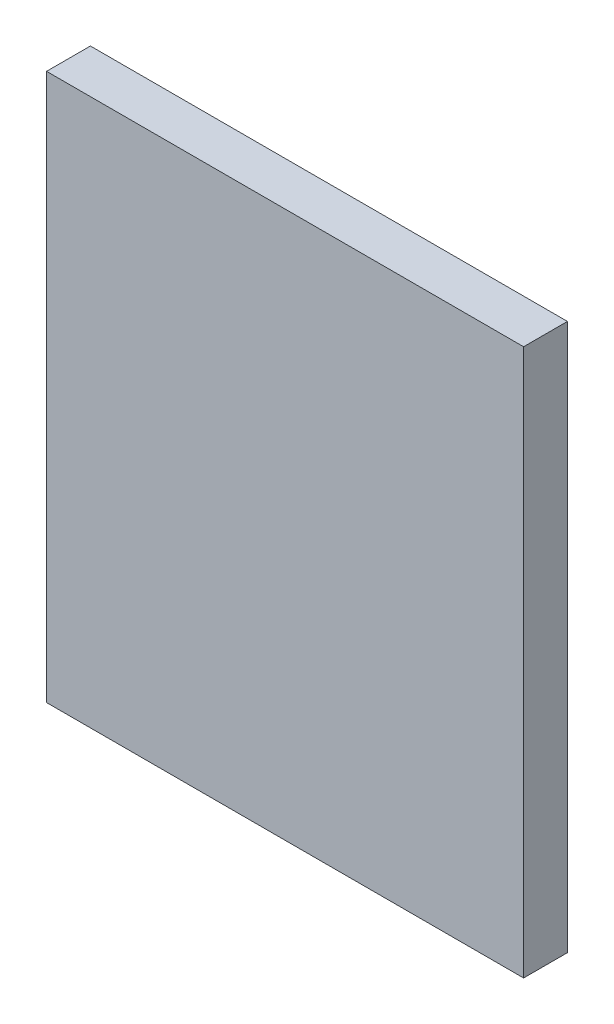
ISO-10303-21;
HEADER;
FILE_DESCRIPTION(('STEP AP214'),'2;1');
FILE_NAME('part.step','',(''),(''),'','','');
FILE_SCHEMA(('AUTOMOTIVE_DESIGN { 1 0 10303 214 1 1 1 1 }'));
ENDSEC;
DATA;
#1=APPLICATION_CONTEXT('core data for automotive mechanical design processes');
#2=APPLICATION_PROTOCOL_DEFINITION('international standard','automotive_design',2000,#1);
#3=PRODUCT_CONTEXT('',#1,'mechanical');
#4=PRODUCT('Part','Part','',(#3));
#5=PRODUCT_RELATED_PRODUCT_CATEGORY('part','',(#4));
#6=PRODUCT_DEFINITION_FORMATION('','',#4);
#7=PRODUCT_DEFINITION_CONTEXT('part definition',#1,'design');
#8=PRODUCT_DEFINITION('design','',#6,#7);
#9=PRODUCT_DEFINITION_SHAPE('','',#8);
#10=(LENGTH_UNIT() NAMED_UNIT(*) SI_UNIT(.MILLI.,.METRE.));
#11=(NAMED_UNIT(*) PLANE_ANGLE_UNIT() SI_UNIT($,.RADIAN.));
#12=(NAMED_UNIT(*) SI_UNIT($,.STERADIAN.) SOLID_ANGLE_UNIT());
#13=UNCERTAINTY_MEASURE_WITH_UNIT(LENGTH_MEASURE(1.E-05),#10,'distance_accuracy_value','');
#14=(GEOMETRIC_REPRESENTATION_CONTEXT(3) GLOBAL_UNCERTAINTY_ASSIGNED_CONTEXT((#13)) GLOBAL_UNIT_ASSIGNED_CONTEXT((#10,
#11,#12)) REPRESENTATION_CONTEXT('',''));
#15=CARTESIAN_POINT('',(0.,0.,0.));
#16=DIRECTION('',(0.,0.,1.));
#17=DIRECTION('',(1.,0.,0.));
#18=AXIS2_PLACEMENT_3D('',#15,#16,#17);
#19=CARTESIAN_POINT('',(0.,0.,0.));
#20=DIRECTION('',(0.,0.,1.));
#21=DIRECTION('',(1.,0.,0.));
#22=AXIS2_PLACEMENT_3D('',#19,#20,#21);
#23=PLANE('',#22);
#24=DIRECTION('',(0.,-1.,0.));
#25=VECTOR('',#24,1.);
#26=CARTESIAN_POINT('',(-4.869,5.58,0.));
#27=LINE('',#26,#25);
#28=CARTESIAN_POINT('',(-4.869,5.58,0.));
#29=VERTEX_POINT('',#28);
#30=CARTESIAN_POINT('',(-4.869,-5.58,0.));
#31=VERTEX_POINT('',#30);
#32=EDGE_CURVE('E79',#29,#31,#27,.T.);
#33=ORIENTED_EDGE('',*,*,#32,.F.);
#34=DIRECTION('',(-1.,0.,0.));
#35=VECTOR('',#34,1.);
#36=CARTESIAN_POINT('',(4.869,5.58,0.));
#37=LINE('',#36,#35);
#38=CARTESIAN_POINT('',(4.869,5.58,0.));
#39=VERTEX_POINT('',#38);
#40=EDGE_CURVE('E55',#39,#29,#37,.T.);
#41=ORIENTED_EDGE('',*,*,#40,.F.);
#42=DIRECTION('',(0.,1.,0.));
#43=VECTOR('',#42,1.);
#44=CARTESIAN_POINT('',(4.869,-5.58,0.));
#45=LINE('',#44,#43);
#46=CARTESIAN_POINT('',(4.869,-5.58,0.));
#47=VERTEX_POINT('',#46);
#48=EDGE_CURVE('E57',#47,#39,#45,.T.);
#49=ORIENTED_EDGE('',*,*,#48,.F.);
#50=DIRECTION('',(1.,0.,0.));
#51=VECTOR('',#50,1.);
#52=CARTESIAN_POINT('',(-4.869,-5.58,0.));
#53=LINE('',#52,#51);
#54=EDGE_CURVE('E20',#31,#47,#53,.T.);
#55=ORIENTED_EDGE('',*,*,#54,.F.);
#56=EDGE_LOOP('',(#33,#41,#49,#55));
#57=FACE_BOUND('',#56,.T.);
#58=ADVANCED_FACE('F17',(#57),#23,.F.);
#59=CARTESIAN_POINT('',(-4.869,-5.58,0.));
#60=DIRECTION('',(0.,-1.,0.));
#61=DIRECTION('',(1.,0.,0.));
#62=AXIS2_PLACEMENT_3D('',#59,#60,#61);
#63=PLANE('',#62);
#64=DIRECTION('',(1.,0.,0.));
#65=VECTOR('',#64,1.);
#66=CARTESIAN_POINT('',(0.,-5.58,0.895000000000003));
#67=LINE('',#66,#65);
#68=CARTESIAN_POINT('',(-4.869,-5.58,0.895000000000002));
#69=VERTEX_POINT('',#68);
#70=CARTESIAN_POINT('',(4.869,-5.58,0.895000000000002));
#71=VERTEX_POINT('',#70);
#72=EDGE_CURVE('E83',#69,#71,#67,.T.);
#73=ORIENTED_EDGE('',*,*,#72,.F.);
#74=DIRECTION('',(0.,0.,1.));
#75=VECTOR('',#74,1.);
#76=CARTESIAN_POINT('',(-4.869,-5.58,0.));
#77=LINE('',#76,#75);
#78=EDGE_CURVE('E68',#31,#69,#77,.T.);
#79=ORIENTED_EDGE('',*,*,#78,.F.);
#80=ORIENTED_EDGE('',*,*,#54,.T.);
#81=DIRECTION('',(0.,0.,1.));
#82=VECTOR('',#81,1.);
#83=CARTESIAN_POINT('',(4.869,-5.58,0.));
#84=LINE('',#83,#82);
#85=EDGE_CURVE('E63',#71,#47,#84,.F.);
#86=ORIENTED_EDGE('',*,*,#85,.F.);
#87=EDGE_LOOP('',(#73,#79,#80,#86));
#88=FACE_BOUND('',#87,.T.);
#89=ADVANCED_FACE('F65',(#88),#63,.T.);
#90=CARTESIAN_POINT('',(4.869,-5.58,0.));
#91=DIRECTION('',(1.,0.,0.));
#92=DIRECTION('',(0.,1.,0.));
#93=AXIS2_PLACEMENT_3D('',#90,#91,#92);
#94=PLANE('',#93);
#95=DIRECTION('',(0.,1.,0.));
#96=VECTOR('',#95,1.);
#97=CARTESIAN_POINT('',(4.869,0.,0.895000000000003));
#98=LINE('',#97,#96);
#99=CARTESIAN_POINT('',(4.869,5.58,0.895));
#100=VERTEX_POINT('',#99);
#101=EDGE_CURVE('E72',#71,#100,#98,.T.);
#102=ORIENTED_EDGE('',*,*,#101,.F.);
#103=ORIENTED_EDGE('',*,*,#85,.T.);
#104=ORIENTED_EDGE('',*,*,#48,.T.);
#105=DIRECTION('',(0.,0.,1.));
#106=VECTOR('',#105,1.);
#107=CARTESIAN_POINT('',(4.869,5.58,0.));
#108=LINE('',#107,#106);
#109=EDGE_CURVE('E75',#100,#39,#108,.F.);
#110=ORIENTED_EDGE('',*,*,#109,.F.);
#111=EDGE_LOOP('',(#102,#103,#104,#110));
#112=FACE_BOUND('',#111,.T.);
#113=ADVANCED_FACE('F70',(#112),#94,.T.);
#114=CARTESIAN_POINT('',(4.869,5.58,0.));
#115=DIRECTION('',(0.,1.,0.));
#116=DIRECTION('',(-1.,0.,0.));
#117=AXIS2_PLACEMENT_3D('',#114,#115,#116);
#118=PLANE('',#117);
#119=DIRECTION('',(1.,0.,0.));
#120=VECTOR('',#119,1.);
#121=CARTESIAN_POINT('',(0.,5.58,0.895000000000003));
#122=LINE('',#121,#120);
#123=CARTESIAN_POINT('',(-4.869,5.58,0.894999999999999));
#124=VERTEX_POINT('',#123);
#125=EDGE_CURVE('E26',#100,#124,#122,.F.);
#126=ORIENTED_EDGE('',*,*,#125,.F.);
#127=ORIENTED_EDGE('',*,*,#109,.T.);
#128=ORIENTED_EDGE('',*,*,#40,.T.);
#129=DIRECTION('',(0.,0.,1.));
#130=VECTOR('',#129,1.);
#131=CARTESIAN_POINT('',(-4.869,5.58,0.));
#132=LINE('',#131,#130);
#133=EDGE_CURVE('E35',#124,#29,#132,.F.);
#134=ORIENTED_EDGE('',*,*,#133,.F.);
#135=EDGE_LOOP('',(#126,#127,#128,#134));
#136=FACE_BOUND('',#135,.T.);
#137=ADVANCED_FACE('F89',(#136),#118,.T.);
#138=CARTESIAN_POINT('',(-4.869,5.58,0.));
#139=DIRECTION('',(-1.,0.,0.));
#140=DIRECTION('',(0.,-1.,0.));
#141=AXIS2_PLACEMENT_3D('',#138,#139,#140);
#142=PLANE('',#141);
#143=DIRECTION('',(0.,1.,0.));
#144=VECTOR('',#143,1.);
#145=CARTESIAN_POINT('',(-4.869,0.,0.895000000000003));
#146=LINE('',#145,#144);
#147=EDGE_CURVE('E11',#124,#69,#146,.F.);
#148=ORIENTED_EDGE('',*,*,#147,.F.);
#149=ORIENTED_EDGE('',*,*,#133,.T.);
#150=ORIENTED_EDGE('',*,*,#32,.T.);
#151=ORIENTED_EDGE('',*,*,#78,.T.);
#152=EDGE_LOOP('',(#148,#149,#150,#151));
#153=FACE_BOUND('',#152,.T.);
#154=ADVANCED_FACE('F91',(#153),#142,.T.);
#155=CARTESIAN_POINT('',(0.,0.,0.895000000000003));
#156=DIRECTION('',(0.,0.,1.));
#157=DIRECTION('',(1.,0.,0.));
#158=AXIS2_PLACEMENT_3D('',#155,#156,#157);
#159=PLANE('',#158);
#160=ORIENTED_EDGE('',*,*,#125,.T.);
#161=ORIENTED_EDGE('',*,*,#147,.T.);
#162=ORIENTED_EDGE('',*,*,#72,.T.);
#163=ORIENTED_EDGE('',*,*,#101,.T.);
#164=EDGE_LOOP('',(#160,#161,#162,#163));
#165=FACE_BOUND('',#164,.T.);
#166=ADVANCED_FACE('F88',(#165),#159,.T.);
#167=CLOSED_SHELL('',(#58,#89,#113,#137,#154,#166));
#168=MANIFOLD_SOLID_BREP('B1',#167);
#169=ADVANCED_BREP_SHAPE_REPRESENTATION('',(#18,#168),#14);
#170=SHAPE_DEFINITION_REPRESENTATION(#9,#169);
ENDSEC;
END-ISO-10303-21;
